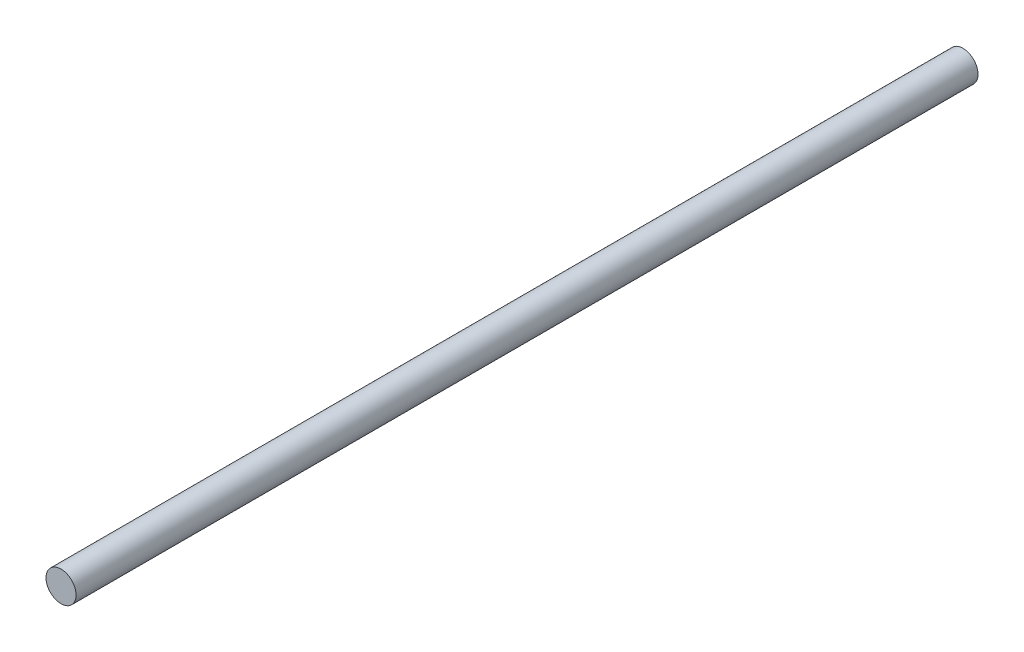
ISO-10303-21;
HEADER;
FILE_DESCRIPTION(('STEP AP214'),'2;1');
FILE_NAME('part.step','',(''),(''),'','','');
FILE_SCHEMA(('AUTOMOTIVE_DESIGN { 1 0 10303 214 1 1 1 1 }'));
ENDSEC;
DATA;
#1=APPLICATION_CONTEXT('core data for automotive mechanical design processes');
#2=APPLICATION_PROTOCOL_DEFINITION('international standard','automotive_design',2000,#1);
#3=PRODUCT_CONTEXT('',#1,'mechanical');
#4=PRODUCT('Part','Part','',(#3));
#5=PRODUCT_RELATED_PRODUCT_CATEGORY('part','',(#4));
#6=PRODUCT_DEFINITION_FORMATION('','',#4);
#7=PRODUCT_DEFINITION_CONTEXT('part definition',#1,'design');
#8=PRODUCT_DEFINITION('design','',#6,#7);
#9=PRODUCT_DEFINITION_SHAPE('','',#8);
#10=(LENGTH_UNIT() NAMED_UNIT(*) SI_UNIT(.MILLI.,.METRE.));
#11=(NAMED_UNIT(*) PLANE_ANGLE_UNIT() SI_UNIT($,.RADIAN.));
#12=(NAMED_UNIT(*) SI_UNIT($,.STERADIAN.) SOLID_ANGLE_UNIT());
#13=UNCERTAINTY_MEASURE_WITH_UNIT(LENGTH_MEASURE(1.E-05),#10,'distance_accuracy_value','');
#14=(GEOMETRIC_REPRESENTATION_CONTEXT(3) GLOBAL_UNCERTAINTY_ASSIGNED_CONTEXT((#13)) GLOBAL_UNIT_ASSIGNED_CONTEXT((#10,
#11,#12)) REPRESENTATION_CONTEXT('',''));
#15=CARTESIAN_POINT('',(0.,0.,0.));
#16=DIRECTION('',(0.,0.,1.));
#17=DIRECTION('',(1.,0.,0.));
#18=AXIS2_PLACEMENT_3D('',#15,#16,#17);
#19=CARTESIAN_POINT('',(0.,0.,90.));
#20=DIRECTION('',(0.,0.,-1.));
#21=DIRECTION('',(-1.,0.,0.));
#22=AXIS2_PLACEMENT_3D('',#19,#20,#21);
#23=CYLINDRICAL_SURFACE('',#22,3.);
#24=CARTESIAN_POINT('',(0.,0.,90.));
#25=DIRECTION('',(0.,0.,1.));
#26=DIRECTION('',(1.,0.,0.));
#27=AXIS2_PLACEMENT_3D('',#24,#25,#26);
#28=CIRCLE('',#27,3.);
#29=CARTESIAN_POINT('',(-3.,0.,90.));
#30=VERTEX_POINT('',#29);
#31=EDGE_CURVE('E10',#30,#30,#28,.T.);
#32=CARTESIAN_POINT('',(0.,0.,-90.));
#33=DIRECTION('',(0.,0.,1.));
#34=DIRECTION('',(1.,0.,0.));
#35=AXIS2_PLACEMENT_3D('',#32,#33,#34);
#36=CIRCLE('',#35,3.);
#37=CARTESIAN_POINT('',(-3.,0.,-90.));
#38=VERTEX_POINT('',#37);
#39=EDGE_CURVE('E33',#38,#38,#36,.T.);
#40=CARTESIAN_POINT('',(-3.,0.,90.));
#41=CARTESIAN_POINT('',(-3.,0.,88.125));
#42=CARTESIAN_POINT('',(-3.,0.,86.25));
#43=CARTESIAN_POINT('',(-3.,0.,82.5));
#44=CARTESIAN_POINT('',(-3.,0.,80.625));
#45=CARTESIAN_POINT('',(-3.,0.,76.875));
#46=CARTESIAN_POINT('',(-3.,0.,75.));
#47=CARTESIAN_POINT('',(-3.,0.,71.25));
#48=CARTESIAN_POINT('',(-3.,0.,69.375));
#49=CARTESIAN_POINT('',(-3.,0.,65.625));
#50=CARTESIAN_POINT('',(-3.,0.,63.75));
#51=CARTESIAN_POINT('',(-3.,0.,60.));
#52=CARTESIAN_POINT('',(-3.,0.,58.125));
#53=CARTESIAN_POINT('',(-3.,0.,54.375));
#54=CARTESIAN_POINT('',(-3.,0.,52.5));
#55=CARTESIAN_POINT('',(-3.,0.,48.75));
#56=CARTESIAN_POINT('',(-3.,0.,46.875));
#57=CARTESIAN_POINT('',(-3.,0.,43.125));
#58=CARTESIAN_POINT('',(-3.,0.,41.25));
#59=CARTESIAN_POINT('',(-3.,0.,37.5));
#60=CARTESIAN_POINT('',(-3.,0.,35.625));
#61=CARTESIAN_POINT('',(-3.,0.,31.875));
#62=CARTESIAN_POINT('',(-3.,0.,30.));
#63=CARTESIAN_POINT('',(-3.,0.,26.25));
#64=CARTESIAN_POINT('',(-3.,0.,24.375));
#65=CARTESIAN_POINT('',(-3.,0.,20.625));
#66=CARTESIAN_POINT('',(-3.,0.,18.75));
#67=CARTESIAN_POINT('',(-3.,0.,15.));
#68=CARTESIAN_POINT('',(-3.,0.,13.125));
#69=CARTESIAN_POINT('',(-3.,0.,9.37499999999998));
#70=CARTESIAN_POINT('',(-3.,0.,7.49999999999998));
#71=CARTESIAN_POINT('',(-3.,0.,3.74999999999998));
#72=CARTESIAN_POINT('',(-3.,0.,1.87499999999997));
#73=CARTESIAN_POINT('',(-3.,0.,-1.87500000000003));
#74=CARTESIAN_POINT('',(-3.,0.,-3.75000000000003));
#75=CARTESIAN_POINT('',(-3.,0.,-7.50000000000003));
#76=CARTESIAN_POINT('',(-3.,0.,-9.37500000000004));
#77=CARTESIAN_POINT('',(-3.,0.,-13.125));
#78=CARTESIAN_POINT('',(-3.,0.,-15.));
#79=CARTESIAN_POINT('',(-3.,0.,-18.75));
#80=CARTESIAN_POINT('',(-3.,0.,-20.625));
#81=CARTESIAN_POINT('',(-3.,0.,-24.375));
#82=CARTESIAN_POINT('',(-3.,0.,-26.25));
#83=CARTESIAN_POINT('',(-3.,0.,-30.));
#84=CARTESIAN_POINT('',(-3.,0.,-31.875));
#85=CARTESIAN_POINT('',(-3.,0.,-35.625));
#86=CARTESIAN_POINT('',(-3.,0.,-37.5));
#87=CARTESIAN_POINT('',(-3.,0.,-41.25));
#88=CARTESIAN_POINT('',(-3.,0.,-43.125));
#89=CARTESIAN_POINT('',(-3.,0.,-46.875));
#90=CARTESIAN_POINT('',(-3.,0.,-48.75));
#91=CARTESIAN_POINT('',(-3.,0.,-52.5));
#92=CARTESIAN_POINT('',(-3.,0.,-54.375));
#93=CARTESIAN_POINT('',(-3.,0.,-58.125));
#94=CARTESIAN_POINT('',(-3.,0.,-60.));
#95=CARTESIAN_POINT('',(-3.,0.,-63.75));
#96=CARTESIAN_POINT('',(-3.,0.,-65.625));
#97=CARTESIAN_POINT('',(-3.,0.,-69.375));
#98=CARTESIAN_POINT('',(-3.,0.,-71.25));
#99=CARTESIAN_POINT('',(-3.,0.,-75.));
#100=CARTESIAN_POINT('',(-3.,0.,-76.875));
#101=CARTESIAN_POINT('',(-3.,0.,-80.625));
#102=CARTESIAN_POINT('',(-3.,0.,-82.5));
#103=CARTESIAN_POINT('',(-3.,0.,-86.25));
#104=CARTESIAN_POINT('',(-3.,0.,-88.125));
#105=CARTESIAN_POINT('',(-3.,0.,-90.));
#106=B_SPLINE_CURVE_WITH_KNOTS('',3,(#40,#41,#42,#43,#44,#45,#46,#47,#48,#49,#50,#51,#52,#53,
#54,#55,#56,#57,#58,#59,#60,#61,#62,#63,#64,#65,#66,#67,#68,#69,#70,#71,#72,#73,#74,#75,#76,#77,
#78,#79,#80,#81,#82,#83,#84,#85,#86,#87,#88,#89,#90,#91,#92,#93,#94,#95,#96,#97,#98,#99,#100,
#101,#102,#103,#104,#105),.UNSPECIFIED.,.F.,.F.,(4,2,2,2,2,2,2,2,2,2,2,2,2,2,2,2,2,2,2,2,2,2,2,
2,2,2,2,2,2,2,2,2,4),(0.,5.62499999999999,11.25,16.875,22.5,28.125,33.75,39.375,45.,50.625,
56.25,61.875,67.5,73.125,78.75,84.375,90.,95.625,101.25,106.875,112.5,118.125,123.75,129.375,
135.,140.625,146.25,151.875,157.5,163.125,168.75,174.375,180.),.UNSPECIFIED.);
#107=EDGE_CURVE('BSEAM30',#30,#38,#106,.T.);
#108=ORIENTED_EDGE('',*,*,#31,.F.);
#109=ORIENTED_EDGE('',*,*,#39,.T.);
#110=ORIENTED_EDGE('',*,*,#107,.T.);
#111=ORIENTED_EDGE('',*,*,#107,.F.);
#112=EDGE_LOOP('',(#108,#110,#109,#111));
#113=FACE_BOUND('',#112,.T.);
#114=ADVANCED_FACE('F30',(#113),#23,.T.);
#115=CARTESIAN_POINT('',(0.,0.,90.));
#116=DIRECTION('',(0.,0.,1.));
#117=DIRECTION('',(1.,0.,0.));
#118=AXIS2_PLACEMENT_3D('',#115,#116,#117);
#119=PLANE('',#118);
#120=ORIENTED_EDGE('',*,*,#31,.T.);
#121=EDGE_LOOP('',(#120));
#122=FACE_BOUND('',#121,.T.);
#123=ADVANCED_FACE('F45',(#122),#119,.T.);
#124=CARTESIAN_POINT('',(0.,0.,-90.));
#125=DIRECTION('',(0.,0.,1.));
#126=DIRECTION('',(1.,0.,0.));
#127=AXIS2_PLACEMENT_3D('',#124,#125,#126);
#128=PLANE('',#127);
#129=ORIENTED_EDGE('',*,*,#39,.F.);
#130=EDGE_LOOP('',(#129));
#131=FACE_BOUND('',#130,.T.);
#132=ADVANCED_FACE('F43',(#131),#128,.F.);
#133=CLOSED_SHELL('',(#114,#123,#132));
#134=MANIFOLD_SOLID_BREP('B2',#133);
#135=ADVANCED_BREP_SHAPE_REPRESENTATION('',(#18,#134),#14);
#136=SHAPE_DEFINITION_REPRESENTATION(#9,#135);
ENDSEC;
END-ISO-10303-21;
